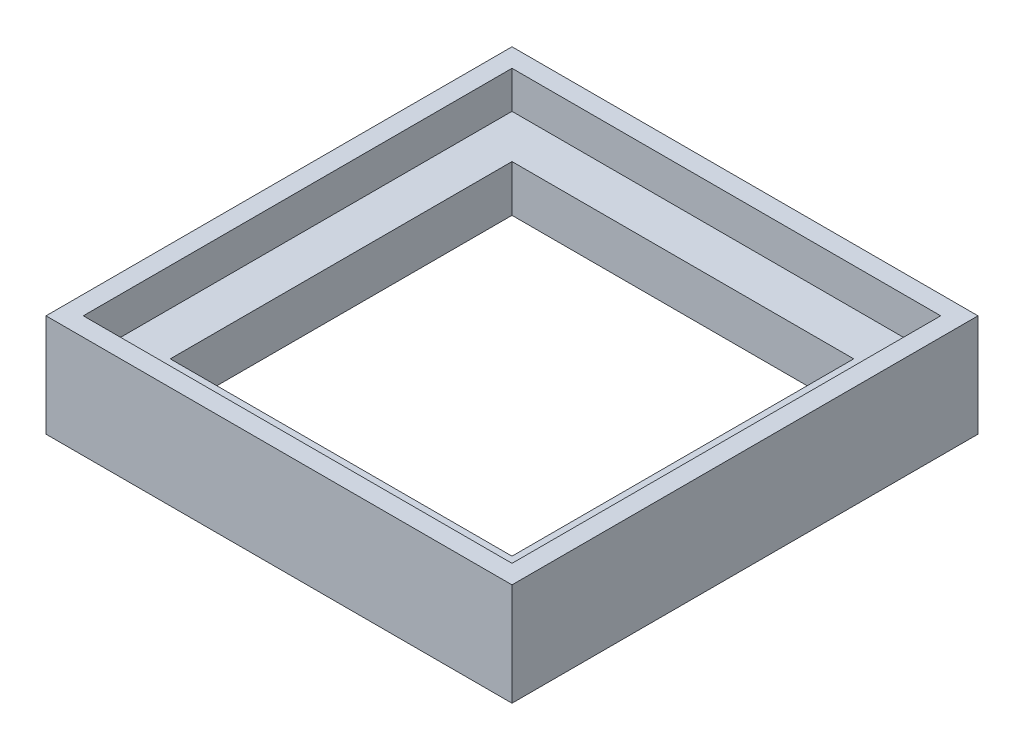
ISO-10303-21;
HEADER;
FILE_DESCRIPTION(('STEP AP214'),'2;1');
FILE_NAME('part.step','',(''),(''),'','','');
FILE_SCHEMA(('AUTOMOTIVE_DESIGN { 1 0 10303 214 1 1 1 1 }'));
ENDSEC;
DATA;
#1=APPLICATION_CONTEXT('core data for automotive mechanical design processes');
#2=APPLICATION_PROTOCOL_DEFINITION('international standard','automotive_design',2000,#1);
#3=PRODUCT_CONTEXT('',#1,'mechanical');
#4=PRODUCT('Part','Part','',(#3));
#5=PRODUCT_RELATED_PRODUCT_CATEGORY('part','',(#4));
#6=PRODUCT_DEFINITION_FORMATION('','',#4);
#7=PRODUCT_DEFINITION_CONTEXT('part definition',#1,'design');
#8=PRODUCT_DEFINITION('design','',#6,#7);
#9=PRODUCT_DEFINITION_SHAPE('','',#8);
#10=(LENGTH_UNIT() NAMED_UNIT(*) SI_UNIT(.MILLI.,.METRE.));
#11=(NAMED_UNIT(*) PLANE_ANGLE_UNIT() SI_UNIT($,.RADIAN.));
#12=(NAMED_UNIT(*) SI_UNIT($,.STERADIAN.) SOLID_ANGLE_UNIT());
#13=UNCERTAINTY_MEASURE_WITH_UNIT(LENGTH_MEASURE(1.E-05),#10,'distance_accuracy_value','');
#14=(GEOMETRIC_REPRESENTATION_CONTEXT(3) GLOBAL_UNCERTAINTY_ASSIGNED_CONTEXT((#13)) GLOBAL_UNIT_ASSIGNED_CONTEXT((#10,
#11,#12)) REPRESENTATION_CONTEXT('',''));
#15=CARTESIAN_POINT('',(0.,0.,0.));
#16=DIRECTION('',(0.,0.,1.));
#17=DIRECTION('',(1.,0.,0.));
#18=AXIS2_PLACEMENT_3D('',#15,#16,#17);
#19=CARTESIAN_POINT('',(0.,21.,0.));
#20=DIRECTION('',(0.,-1.,0.));
#21=DIRECTION('',(0.,0.,-1.));
#22=AXIS2_PLACEMENT_3D('',#19,#20,#21);
#23=PLANE('',#22);
#24=DIRECTION('',(0.,0.,-1.));
#25=VECTOR('',#24,1.);
#26=CARTESIAN_POINT('',(69.,21.,69.));
#27=LINE('',#26,#25);
#28=CARTESIAN_POINT('',(69.,21.,69.));
#29=VERTEX_POINT('',#28);
#30=CARTESIAN_POINT('',(69.,21.,-69.));
#31=VERTEX_POINT('',#30);
#32=EDGE_CURVE('E232',#29,#31,#27,.T.);
#33=ORIENTED_EDGE('',*,*,#32,.T.);
#34=DIRECTION('',(-1.,0.,0.));
#35=VECTOR('',#34,1.);
#36=CARTESIAN_POINT('',(-69.,21.,-69.));
#37=LINE('',#36,#35);
#38=CARTESIAN_POINT('',(-69.,21.,-69.));
#39=VERTEX_POINT('',#38);
#40=EDGE_CURVE('E236',#31,#39,#37,.T.);
#41=ORIENTED_EDGE('',*,*,#40,.T.);
#42=DIRECTION('',(0.,0.,1.));
#43=VECTOR('',#42,1.);
#44=CARTESIAN_POINT('',(-69.,21.,69.));
#45=LINE('',#44,#43);
#46=CARTESIAN_POINT('',(-69.,21.,69.));
#47=VERTEX_POINT('',#46);
#48=EDGE_CURVE('E241',#39,#47,#45,.T.);
#49=ORIENTED_EDGE('',*,*,#48,.T.);
#50=DIRECTION('',(1.,0.,0.));
#51=VECTOR('',#50,1.);
#52=CARTESIAN_POINT('',(-69.,21.,69.));
#53=LINE('',#52,#51);
#54=EDGE_CURVE('E245',#47,#29,#53,.T.);
#55=ORIENTED_EDGE('',*,*,#54,.T.);
#56=EDGE_LOOP('',(#33,#41,#49,#55));
#57=FACE_BOUND('',#56,.T.);
#58=DIRECTION('',(0.,0.,-1.));
#59=VECTOR('',#58,1.);
#60=CARTESIAN_POINT('',(55.,21.,55.));
#61=LINE('',#60,#59);
#62=CARTESIAN_POINT('',(55.,21.,55.));
#63=VERTEX_POINT('',#62);
#64=CARTESIAN_POINT('',(55.,21.,-55.));
#65=VERTEX_POINT('',#64);
#66=EDGE_CURVE('E164',#63,#65,#61,.T.);
#67=ORIENTED_EDGE('',*,*,#66,.F.);
#68=DIRECTION('',(1.,0.,0.));
#69=VECTOR('',#68,1.);
#70=CARTESIAN_POINT('',(-55.,21.,55.));
#71=LINE('',#70,#69);
#72=CARTESIAN_POINT('',(-55.,21.,55.));
#73=VERTEX_POINT('',#72);
#74=EDGE_CURVE('E161',#73,#63,#71,.T.);
#75=ORIENTED_EDGE('',*,*,#74,.F.);
#76=DIRECTION('',(0.,0.,1.));
#77=VECTOR('',#76,1.);
#78=CARTESIAN_POINT('',(-55.,21.,55.));
#79=LINE('',#78,#77);
#80=CARTESIAN_POINT('',(-55.,21.,-55.));
#81=VERTEX_POINT('',#80);
#82=EDGE_CURVE('E55',#81,#73,#79,.T.);
#83=ORIENTED_EDGE('',*,*,#82,.F.);
#84=DIRECTION('',(-1.,0.,0.));
#85=VECTOR('',#84,1.);
#86=CARTESIAN_POINT('',(-55.,21.,-55.));
#87=LINE('',#86,#85);
#88=EDGE_CURVE('E156',#65,#81,#87,.T.);
#89=ORIENTED_EDGE('',*,*,#88,.F.);
#90=EDGE_LOOP('',(#67,#75,#83,#89));
#91=FACE_BOUND('',#90,.T.);
#92=ADVANCED_FACE('F39',(#57,#91),#23,.F.);
#93=CARTESIAN_POINT('',(75.,33.,75.));
#94=DIRECTION('',(-1.,0.,0.));
#95=DIRECTION('',(0.,0.,1.));
#96=AXIS2_PLACEMENT_3D('',#93,#94,#95);
#97=PLANE('',#96);
#98=DIRECTION('',(0.,0.,-1.));
#99=VECTOR('',#98,1.);
#100=CARTESIAN_POINT('',(75.,0.,75.));
#101=LINE('',#100,#99);
#102=CARTESIAN_POINT('',(75.,0.,75.));
#103=VERTEX_POINT('',#102);
#104=CARTESIAN_POINT('',(75.,0.,-75.));
#105=VERTEX_POINT('',#104);
#106=EDGE_CURVE('E266',#103,#105,#101,.T.);
#107=ORIENTED_EDGE('',*,*,#106,.T.);
#108=DIRECTION('',(0.,-1.,0.));
#109=VECTOR('',#108,1.);
#110=CARTESIAN_POINT('',(75.,33.,-75.));
#111=LINE('',#110,#109);
#112=CARTESIAN_POINT('',(75.,33.,-75.));
#113=VERTEX_POINT('',#112);
#114=EDGE_CURVE('E313',#113,#105,#111,.T.);
#115=ORIENTED_EDGE('',*,*,#114,.F.);
#116=DIRECTION('',(0.,0.,-1.));
#117=VECTOR('',#116,1.);
#118=CARTESIAN_POINT('',(75.,33.,75.));
#119=LINE('',#118,#117);
#120=CARTESIAN_POINT('',(75.,33.,75.));
#121=VERTEX_POINT('',#120);
#122=EDGE_CURVE('E276',#121,#113,#119,.T.);
#123=ORIENTED_EDGE('',*,*,#122,.F.);
#124=DIRECTION('',(0.,-1.,0.));
#125=VECTOR('',#124,1.);
#126=CARTESIAN_POINT('',(75.,33.,75.));
#127=LINE('',#126,#125);
#128=EDGE_CURVE('E290',#121,#103,#127,.T.);
#129=ORIENTED_EDGE('',*,*,#128,.T.);
#130=EDGE_LOOP('',(#107,#115,#123,#129));
#131=FACE_BOUND('',#130,.T.);
#132=ADVANCED_FACE('F41',(#131),#97,.F.);
#133=CARTESIAN_POINT('',(-75.,33.,-75.));
#134=DIRECTION('',(0.,0.,1.));
#135=DIRECTION('',(1.,0.,0.));
#136=AXIS2_PLACEMENT_3D('',#133,#134,#135);
#137=PLANE('',#136);
#138=DIRECTION('',(-1.,0.,0.));
#139=VECTOR('',#138,1.);
#140=CARTESIAN_POINT('',(-75.,0.,-75.));
#141=LINE('',#140,#139);
#142=CARTESIAN_POINT('',(-75.,0.,-75.));
#143=VERTEX_POINT('',#142);
#144=EDGE_CURVE('E294',#105,#143,#141,.T.);
#145=ORIENTED_EDGE('',*,*,#144,.T.);
#146=DIRECTION('',(0.,-1.,0.));
#147=VECTOR('',#146,1.);
#148=CARTESIAN_POINT('',(-75.,33.,-75.));
#149=LINE('',#148,#147);
#150=CARTESIAN_POINT('',(-75.,33.,-75.));
#151=VERTEX_POINT('',#150);
#152=EDGE_CURVE('E309',#151,#143,#149,.T.);
#153=ORIENTED_EDGE('',*,*,#152,.F.);
#154=DIRECTION('',(-1.,0.,0.));
#155=VECTOR('',#154,1.);
#156=CARTESIAN_POINT('',(-75.,33.,-75.));
#157=LINE('',#156,#155);
#158=EDGE_CURVE('E280',#113,#151,#157,.T.);
#159=ORIENTED_EDGE('',*,*,#158,.F.);
#160=ORIENTED_EDGE('',*,*,#114,.T.);
#161=EDGE_LOOP('',(#145,#153,#159,#160));
#162=FACE_BOUND('',#161,.T.);
#163=ADVANCED_FACE('F344',(#162),#137,.F.);
#164=CARTESIAN_POINT('',(-75.,33.,75.));
#165=DIRECTION('',(1.,0.,0.));
#166=DIRECTION('',(0.,0.,-1.));
#167=AXIS2_PLACEMENT_3D('',#164,#165,#166);
#168=PLANE('',#167);
#169=DIRECTION('',(0.,0.,1.));
#170=VECTOR('',#169,1.);
#171=CARTESIAN_POINT('',(-75.,0.,75.));
#172=LINE('',#171,#170);
#173=CARTESIAN_POINT('',(-75.,0.,75.));
#174=VERTEX_POINT('',#173);
#175=EDGE_CURVE('E297',#143,#174,#172,.T.);
#176=ORIENTED_EDGE('',*,*,#175,.T.);
#177=DIRECTION('',(0.,-1.,0.));
#178=VECTOR('',#177,1.);
#179=CARTESIAN_POINT('',(-75.,33.,75.));
#180=LINE('',#179,#178);
#181=CARTESIAN_POINT('',(-75.,33.,75.));
#182=VERTEX_POINT('',#181);
#183=EDGE_CURVE('E305',#182,#174,#180,.T.);
#184=ORIENTED_EDGE('',*,*,#183,.F.);
#185=DIRECTION('',(0.,0.,1.));
#186=VECTOR('',#185,1.);
#187=CARTESIAN_POINT('',(-75.,33.,75.));
#188=LINE('',#187,#186);
#189=EDGE_CURVE('E284',#151,#182,#188,.T.);
#190=ORIENTED_EDGE('',*,*,#189,.F.);
#191=ORIENTED_EDGE('',*,*,#152,.T.);
#192=EDGE_LOOP('',(#176,#184,#190,#191));
#193=FACE_BOUND('',#192,.T.);
#194=ADVANCED_FACE('F377',(#193),#168,.F.);
#195=CARTESIAN_POINT('',(-75.,33.,75.));
#196=DIRECTION('',(0.,0.,-1.));
#197=DIRECTION('',(-1.,0.,0.));
#198=AXIS2_PLACEMENT_3D('',#195,#196,#197);
#199=PLANE('',#198);
#200=DIRECTION('',(1.,0.,0.));
#201=VECTOR('',#200,1.);
#202=CARTESIAN_POINT('',(-75.,0.,75.));
#203=LINE('',#202,#201);
#204=EDGE_CURVE('E281',#174,#103,#203,.T.);
#205=ORIENTED_EDGE('',*,*,#204,.T.);
#206=ORIENTED_EDGE('',*,*,#128,.F.);
#207=DIRECTION('',(1.,0.,0.));
#208=VECTOR('',#207,1.);
#209=CARTESIAN_POINT('',(-75.,33.,75.));
#210=LINE('',#209,#208);
#211=EDGE_CURVE('E287',#182,#121,#210,.T.);
#212=ORIENTED_EDGE('',*,*,#211,.F.);
#213=ORIENTED_EDGE('',*,*,#183,.T.);
#214=EDGE_LOOP('',(#205,#206,#212,#213));
#215=FACE_BOUND('',#214,.T.);
#216=ADVANCED_FACE('F370',(#215),#199,.F.);
#217=CARTESIAN_POINT('',(0.,33.,0.));
#218=DIRECTION('',(0.,-1.,0.));
#219=DIRECTION('',(0.,0.,-1.));
#220=AXIS2_PLACEMENT_3D('',#217,#218,#219);
#221=PLANE('',#220);
#222=DIRECTION('',(-1.,0.,0.));
#223=VECTOR('',#222,1.);
#224=CARTESIAN_POINT('',(-69.,33.,-69.));
#225=LINE('',#224,#223);
#226=CARTESIAN_POINT('',(69.,33.,-69.));
#227=VERTEX_POINT('',#226);
#228=CARTESIAN_POINT('',(-69.,33.,-69.));
#229=VERTEX_POINT('',#228);
#230=EDGE_CURVE('E252',#227,#229,#225,.T.);
#231=ORIENTED_EDGE('',*,*,#230,.F.);
#232=DIRECTION('',(0.,0.,-1.));
#233=VECTOR('',#232,1.);
#234=CARTESIAN_POINT('',(69.,33.,69.));
#235=LINE('',#234,#233);
#236=CARTESIAN_POINT('',(69.,33.,69.));
#237=VERTEX_POINT('',#236);
#238=EDGE_CURVE('E222',#237,#227,#235,.T.);
#239=ORIENTED_EDGE('',*,*,#238,.F.);
#240=DIRECTION('',(1.,0.,0.));
#241=VECTOR('',#240,1.);
#242=CARTESIAN_POINT('',(-69.,33.,69.));
#243=LINE('',#242,#241);
#244=CARTESIAN_POINT('',(-69.,33.,69.));
#245=VERTEX_POINT('',#244);
#246=EDGE_CURVE('E237',#245,#237,#243,.T.);
#247=ORIENTED_EDGE('',*,*,#246,.F.);
#248=DIRECTION('',(0.,0.,1.));
#249=VECTOR('',#248,1.);
#250=CARTESIAN_POINT('',(-69.,33.,69.));
#251=LINE('',#250,#249);
#252=EDGE_CURVE('E256',#229,#245,#251,.T.);
#253=ORIENTED_EDGE('',*,*,#252,.F.);
#254=EDGE_LOOP('',(#231,#239,#247,#253));
#255=FACE_BOUND('',#254,.T.);
#256=ORIENTED_EDGE('',*,*,#122,.T.);
#257=ORIENTED_EDGE('',*,*,#158,.T.);
#258=ORIENTED_EDGE('',*,*,#189,.T.);
#259=ORIENTED_EDGE('',*,*,#211,.T.);
#260=EDGE_LOOP('',(#256,#257,#258,#259));
#261=FACE_BOUND('',#260,.T.);
#262=ADVANCED_FACE('F367',(#255,#261),#221,.F.);
#263=CARTESIAN_POINT('',(0.,0.,0.));
#264=DIRECTION('',(0.,-1.,0.));
#265=DIRECTION('',(0.,0.,-1.));
#266=AXIS2_PLACEMENT_3D('',#263,#264,#265);
#267=PLANE('',#266);
#268=DIRECTION('',(0.,0.,1.));
#269=VECTOR('',#268,1.);
#270=CARTESIAN_POINT('',(65.,0.,-65.));
#271=LINE('',#270,#269);
#272=CARTESIAN_POINT('',(65.,0.,-65.));
#273=VERTEX_POINT('',#272);
#274=CARTESIAN_POINT('',(65.,0.,65.));
#275=VERTEX_POINT('',#274);
#276=EDGE_CURVE('E182',#273,#275,#271,.T.);
#277=ORIENTED_EDGE('',*,*,#276,.F.);
#278=DIRECTION('',(1.,0.,0.));
#279=VECTOR('',#278,1.);
#280=CARTESIAN_POINT('',(-65.,0.,-65.));
#281=LINE('',#280,#279);
#282=CARTESIAN_POINT('',(-65.,0.,-65.));
#283=VERTEX_POINT('',#282);
#284=EDGE_CURVE('E193',#283,#273,#281,.T.);
#285=ORIENTED_EDGE('',*,*,#284,.F.);
#286=DIRECTION('',(0.,0.,-1.));
#287=VECTOR('',#286,1.);
#288=CARTESIAN_POINT('',(-65.,0.,-65.));
#289=LINE('',#288,#287);
#290=CARTESIAN_POINT('',(-65.,0.,65.));
#291=VERTEX_POINT('',#290);
#292=EDGE_CURVE('E212',#291,#283,#289,.T.);
#293=ORIENTED_EDGE('',*,*,#292,.F.);
#294=DIRECTION('',(-1.,0.,0.));
#295=VECTOR('',#294,1.);
#296=CARTESIAN_POINT('',(-65.,0.,65.));
#297=LINE('',#296,#295);
#298=EDGE_CURVE('E208',#275,#291,#297,.T.);
#299=ORIENTED_EDGE('',*,*,#298,.F.);
#300=EDGE_LOOP('',(#277,#285,#293,#299));
#301=FACE_BOUND('',#300,.T.);
#302=ORIENTED_EDGE('',*,*,#106,.F.);
#303=ORIENTED_EDGE('',*,*,#204,.F.);
#304=ORIENTED_EDGE('',*,*,#175,.F.);
#305=ORIENTED_EDGE('',*,*,#144,.F.);
#306=EDGE_LOOP('',(#302,#303,#304,#305));
#307=FACE_BOUND('',#306,.T.);
#308=ADVANCED_FACE('F365',(#301,#307),#267,.T.);
#309=CARTESIAN_POINT('',(69.,21.,69.));
#310=DIRECTION('',(1.,0.,0.));
#311=DIRECTION('',(0.,0.,-1.));
#312=AXIS2_PLACEMENT_3D('',#309,#310,#311);
#313=PLANE('',#312);
#314=ORIENTED_EDGE('',*,*,#238,.T.);
#315=DIRECTION('',(0.,1.,0.));
#316=VECTOR('',#315,1.);
#317=CARTESIAN_POINT('',(69.,21.,-69.));
#318=LINE('',#317,#316);
#319=EDGE_CURVE('E249',#31,#227,#318,.T.);
#320=ORIENTED_EDGE('',*,*,#319,.F.);
#321=ORIENTED_EDGE('',*,*,#32,.F.);
#322=DIRECTION('',(0.,1.,0.));
#323=VECTOR('',#322,1.);
#324=CARTESIAN_POINT('',(69.,21.,69.));
#325=LINE('',#324,#323);
#326=EDGE_CURVE('E263',#29,#237,#325,.T.);
#327=ORIENTED_EDGE('',*,*,#326,.T.);
#328=EDGE_LOOP('',(#314,#320,#321,#327));
#329=FACE_BOUND('',#328,.T.);
#330=ADVANCED_FACE('F354',(#329),#313,.F.);
#331=CARTESIAN_POINT('',(-69.,21.,69.));
#332=DIRECTION('',(0.,0.,1.));
#333=DIRECTION('',(1.,0.,0.));
#334=AXIS2_PLACEMENT_3D('',#331,#332,#333);
#335=PLANE('',#334);
#336=ORIENTED_EDGE('',*,*,#246,.T.);
#337=ORIENTED_EDGE('',*,*,#326,.F.);
#338=ORIENTED_EDGE('',*,*,#54,.F.);
#339=DIRECTION('',(0.,1.,0.));
#340=VECTOR('',#339,1.);
#341=CARTESIAN_POINT('',(-69.,21.,69.));
#342=LINE('',#341,#340);
#343=EDGE_CURVE('E267',#47,#245,#342,.T.);
#344=ORIENTED_EDGE('',*,*,#343,.T.);
#345=EDGE_LOOP('',(#336,#337,#338,#344));
#346=FACE_BOUND('',#345,.T.);
#347=ADVANCED_FACE('F350',(#346),#335,.F.);
#348=CARTESIAN_POINT('',(-69.,21.,69.));
#349=DIRECTION('',(-1.,0.,0.));
#350=DIRECTION('',(0.,0.,1.));
#351=AXIS2_PLACEMENT_3D('',#348,#349,#350);
#352=PLANE('',#351);
#353=ORIENTED_EDGE('',*,*,#252,.T.);
#354=ORIENTED_EDGE('',*,*,#343,.F.);
#355=ORIENTED_EDGE('',*,*,#48,.F.);
#356=DIRECTION('',(0.,1.,0.));
#357=VECTOR('',#356,1.);
#358=CARTESIAN_POINT('',(-69.,21.,-69.));
#359=LINE('',#358,#357);
#360=EDGE_CURVE('E270',#39,#229,#359,.T.);
#361=ORIENTED_EDGE('',*,*,#360,.T.);
#362=EDGE_LOOP('',(#353,#354,#355,#361));
#363=FACE_BOUND('',#362,.T.);
#364=ADVANCED_FACE('F353',(#363),#352,.F.);
#365=CARTESIAN_POINT('',(-69.,21.,-69.));
#366=DIRECTION('',(0.,0.,-1.));
#367=DIRECTION('',(-1.,0.,0.));
#368=AXIS2_PLACEMENT_3D('',#365,#366,#367);
#369=PLANE('',#368);
#370=ORIENTED_EDGE('',*,*,#230,.T.);
#371=ORIENTED_EDGE('',*,*,#360,.F.);
#372=ORIENTED_EDGE('',*,*,#40,.F.);
#373=ORIENTED_EDGE('',*,*,#319,.T.);
#374=EDGE_LOOP('',(#370,#371,#372,#373));
#375=FACE_BOUND('',#374,.T.);
#376=ADVANCED_FACE('F358',(#375),#369,.F.);
#377=CARTESIAN_POINT('',(65.,6.,-65.));
#378=DIRECTION('',(1.,0.,0.));
#379=DIRECTION('',(0.,0.,-1.));
#380=AXIS2_PLACEMENT_3D('',#377,#378,#379);
#381=PLANE('',#380);
#382=ORIENTED_EDGE('',*,*,#276,.T.);
#383=DIRECTION('',(0.,-1.,0.));
#384=VECTOR('',#383,1.);
#385=CARTESIAN_POINT('',(65.,6.,65.));
#386=LINE('',#385,#384);
#387=CARTESIAN_POINT('',(65.,6.,65.));
#388=VERTEX_POINT('',#387);
#389=EDGE_CURVE('E205',#388,#275,#386,.T.);
#390=ORIENTED_EDGE('',*,*,#389,.F.);
#391=DIRECTION('',(0.,0.,1.));
#392=VECTOR('',#391,1.);
#393=CARTESIAN_POINT('',(65.,6.,-65.));
#394=LINE('',#393,#392);
#395=CARTESIAN_POINT('',(65.,6.,-65.));
#396=VERTEX_POINT('',#395);
#397=EDGE_CURVE('E188',#396,#388,#394,.T.);
#398=ORIENTED_EDGE('',*,*,#397,.F.);
#399=DIRECTION('',(0.,-1.,0.));
#400=VECTOR('',#399,1.);
#401=CARTESIAN_POINT('',(65.,6.,-65.));
#402=LINE('',#401,#400);
#403=EDGE_CURVE('E219',#396,#273,#402,.T.);
#404=ORIENTED_EDGE('',*,*,#403,.T.);
#405=EDGE_LOOP('',(#382,#390,#398,#404));
#406=FACE_BOUND('',#405,.T.);
#407=ADVANCED_FACE('F348',(#406),#381,.F.);
#408=CARTESIAN_POINT('',(-65.,6.,-65.));
#409=DIRECTION('',(0.,0.,-1.));
#410=DIRECTION('',(-1.,0.,0.));
#411=AXIS2_PLACEMENT_3D('',#408,#409,#410);
#412=PLANE('',#411);
#413=ORIENTED_EDGE('',*,*,#284,.T.);
#414=ORIENTED_EDGE('',*,*,#403,.F.);
#415=DIRECTION('',(1.,0.,0.));
#416=VECTOR('',#415,1.);
#417=CARTESIAN_POINT('',(-65.,6.,-65.));
#418=LINE('',#417,#416);
#419=CARTESIAN_POINT('',(-65.,6.,-65.));
#420=VERTEX_POINT('',#419);
#421=EDGE_CURVE('E201',#420,#396,#418,.T.);
#422=ORIENTED_EDGE('',*,*,#421,.F.);
#423=DIRECTION('',(0.,-1.,0.));
#424=VECTOR('',#423,1.);
#425=CARTESIAN_POINT('',(-65.,6.,-65.));
#426=LINE('',#425,#424);
#427=EDGE_CURVE('E223',#420,#283,#426,.T.);
#428=ORIENTED_EDGE('',*,*,#427,.T.);
#429=EDGE_LOOP('',(#413,#414,#422,#428));
#430=FACE_BOUND('',#429,.T.);
#431=ADVANCED_FACE('F437',(#430),#412,.F.);
#432=CARTESIAN_POINT('',(-65.,6.,-65.));
#433=DIRECTION('',(-1.,0.,0.));
#434=DIRECTION('',(0.,0.,1.));
#435=AXIS2_PLACEMENT_3D('',#432,#433,#434);
#436=PLANE('',#435);
#437=ORIENTED_EDGE('',*,*,#292,.T.);
#438=ORIENTED_EDGE('',*,*,#427,.F.);
#439=DIRECTION('',(0.,0.,-1.));
#440=VECTOR('',#439,1.);
#441=CARTESIAN_POINT('',(-65.,6.,-65.));
#442=LINE('',#441,#440);
#443=CARTESIAN_POINT('',(-65.,6.,65.));
#444=VERTEX_POINT('',#443);
#445=EDGE_CURVE('E197',#444,#420,#442,.T.);
#446=ORIENTED_EDGE('',*,*,#445,.F.);
#447=DIRECTION('',(0.,-1.,0.));
#448=VECTOR('',#447,1.);
#449=CARTESIAN_POINT('',(-65.,6.,65.));
#450=LINE('',#449,#448);
#451=EDGE_CURVE('E226',#444,#291,#450,.T.);
#452=ORIENTED_EDGE('',*,*,#451,.T.);
#453=EDGE_LOOP('',(#437,#438,#446,#452));
#454=FACE_BOUND('',#453,.T.);
#455=ADVANCED_FACE('F444',(#454),#436,.F.);
#456=CARTESIAN_POINT('',(-65.,6.,65.));
#457=DIRECTION('',(0.,0.,1.));
#458=DIRECTION('',(1.,0.,0.));
#459=AXIS2_PLACEMENT_3D('',#456,#457,#458);
#460=PLANE('',#459);
#461=ORIENTED_EDGE('',*,*,#298,.T.);
#462=ORIENTED_EDGE('',*,*,#451,.F.);
#463=DIRECTION('',(-1.,0.,0.));
#464=VECTOR('',#463,1.);
#465=CARTESIAN_POINT('',(-65.,6.,65.));
#466=LINE('',#465,#464);
#467=EDGE_CURVE('E192',#388,#444,#466,.T.);
#468=ORIENTED_EDGE('',*,*,#467,.F.);
#469=ORIENTED_EDGE('',*,*,#389,.T.);
#470=EDGE_LOOP('',(#461,#462,#468,#469));
#471=FACE_BOUND('',#470,.T.);
#472=ADVANCED_FACE('F452',(#471),#460,.F.);
#473=CARTESIAN_POINT('',(0.,6.,0.));
#474=DIRECTION('',(0.,1.,0.));
#475=DIRECTION('',(0.,0.,1.));
#476=AXIS2_PLACEMENT_3D('',#473,#474,#475);
#477=PLANE('',#476);
#478=DIRECTION('',(1.,0.,0.));
#479=VECTOR('',#478,1.);
#480=CARTESIAN_POINT('',(0.,6.,55.));
#481=LINE('',#480,#479);
#482=CARTESIAN_POINT('',(-55.,6.,55.));
#483=VERTEX_POINT('',#482);
#484=CARTESIAN_POINT('',(55.,6.,55.));
#485=VERTEX_POINT('',#484);
#486=EDGE_CURVE('E48',#483,#485,#481,.T.);
#487=ORIENTED_EDGE('',*,*,#486,.T.);
#488=DIRECTION('',(0.,0.,-1.));
#489=VECTOR('',#488,1.);
#490=CARTESIAN_POINT('',(55.,6.,0.));
#491=LINE('',#490,#489);
#492=CARTESIAN_POINT('',(55.,6.,-55.));
#493=VERTEX_POINT('',#492);
#494=EDGE_CURVE('E11',#485,#493,#491,.T.);
#495=ORIENTED_EDGE('',*,*,#494,.T.);
#496=DIRECTION('',(-1.,0.,0.));
#497=VECTOR('',#496,1.);
#498=CARTESIAN_POINT('',(0.,6.,-55.));
#499=LINE('',#498,#497);
#500=CARTESIAN_POINT('',(-55.,6.,-55.));
#501=VERTEX_POINT('',#500);
#502=EDGE_CURVE('E158',#493,#501,#499,.T.);
#503=ORIENTED_EDGE('',*,*,#502,.T.);
#504=DIRECTION('',(0.,0.,1.));
#505=VECTOR('',#504,1.);
#506=CARTESIAN_POINT('',(-55.,6.,0.));
#507=LINE('',#506,#505);
#508=EDGE_CURVE('E319',#501,#483,#507,.T.);
#509=ORIENTED_EDGE('',*,*,#508,.T.);
#510=EDGE_LOOP('',(#487,#495,#503,#509));
#511=FACE_BOUND('',#510,.T.);
#512=ORIENTED_EDGE('',*,*,#397,.T.);
#513=ORIENTED_EDGE('',*,*,#467,.T.);
#514=ORIENTED_EDGE('',*,*,#445,.T.);
#515=ORIENTED_EDGE('',*,*,#421,.T.);
#516=EDGE_LOOP('',(#512,#513,#514,#515));
#517=FACE_BOUND('',#516,.T.);
#518=ADVANCED_FACE('F325',(#511,#517),#477,.F.);
#519=CARTESIAN_POINT('',(55.,0.,55.));
#520=DIRECTION('',(1.,0.,0.));
#521=DIRECTION('',(0.,0.,-1.));
#522=AXIS2_PLACEMENT_3D('',#519,#520,#521);
#523=PLANE('',#522);
#524=DIRECTION('',(0.,1.,0.));
#525=VECTOR('',#524,1.);
#526=CARTESIAN_POINT('',(55.,0.,55.));
#527=LINE('',#526,#525);
#528=EDGE_CURVE('E167',#485,#63,#527,.T.);
#529=ORIENTED_EDGE('',*,*,#528,.T.);
#530=ORIENTED_EDGE('',*,*,#66,.T.);
#531=DIRECTION('',(0.,1.,0.));
#532=VECTOR('',#531,1.);
#533=CARTESIAN_POINT('',(55.,0.,-55.));
#534=LINE('',#533,#532);
#535=EDGE_CURVE('E152',#493,#65,#534,.T.);
#536=ORIENTED_EDGE('',*,*,#535,.F.);
#537=ORIENTED_EDGE('',*,*,#494,.F.);
#538=EDGE_LOOP('',(#529,#530,#536,#537));
#539=FACE_BOUND('',#538,.T.);
#540=ADVANCED_FACE('F165',(#539),#523,.F.);
#541=CARTESIAN_POINT('',(-55.,0.,55.));
#542=DIRECTION('',(0.,0.,1.));
#543=DIRECTION('',(1.,0.,0.));
#544=AXIS2_PLACEMENT_3D('',#541,#542,#543);
#545=PLANE('',#544);
#546=DIRECTION('',(0.,1.,0.));
#547=VECTOR('',#546,1.);
#548=CARTESIAN_POINT('',(-55.,0.,55.));
#549=LINE('',#548,#547);
#550=EDGE_CURVE('E183',#483,#73,#549,.T.);
#551=ORIENTED_EDGE('',*,*,#550,.T.);
#552=ORIENTED_EDGE('',*,*,#74,.T.);
#553=ORIENTED_EDGE('',*,*,#528,.F.);
#554=ORIENTED_EDGE('',*,*,#486,.F.);
#555=EDGE_LOOP('',(#551,#552,#553,#554));
#556=FACE_BOUND('',#555,.T.);
#557=ADVANCED_FACE('F328',(#556),#545,.F.);
#558=CARTESIAN_POINT('',(-55.,0.,55.));
#559=DIRECTION('',(-1.,0.,0.));
#560=DIRECTION('',(0.,0.,1.));
#561=AXIS2_PLACEMENT_3D('',#558,#559,#560);
#562=PLANE('',#561);
#563=DIRECTION('',(0.,1.,0.));
#564=VECTOR('',#563,1.);
#565=CARTESIAN_POINT('',(-55.,0.,-55.));
#566=LINE('',#565,#564);
#567=EDGE_CURVE('E62',#501,#81,#566,.T.);
#568=ORIENTED_EDGE('',*,*,#567,.T.);
#569=ORIENTED_EDGE('',*,*,#82,.T.);
#570=ORIENTED_EDGE('',*,*,#550,.F.);
#571=ORIENTED_EDGE('',*,*,#508,.F.);
#572=EDGE_LOOP('',(#568,#569,#570,#571));
#573=FACE_BOUND('',#572,.T.);
#574=ADVANCED_FACE('F329',(#573),#562,.F.);
#575=CARTESIAN_POINT('',(-55.,0.,-55.));
#576=DIRECTION('',(0.,0.,-1.));
#577=DIRECTION('',(-1.,0.,0.));
#578=AXIS2_PLACEMENT_3D('',#575,#576,#577);
#579=PLANE('',#578);
#580=ORIENTED_EDGE('',*,*,#535,.T.);
#581=ORIENTED_EDGE('',*,*,#88,.T.);
#582=ORIENTED_EDGE('',*,*,#567,.F.);
#583=ORIENTED_EDGE('',*,*,#502,.F.);
#584=EDGE_LOOP('',(#580,#581,#582,#583));
#585=FACE_BOUND('',#584,.T.);
#586=ADVANCED_FACE('F154',(#585),#579,.F.);
#587=CLOSED_SHELL('',(#92,#132,#163,#194,#216,#262,#308,#330,#347,#364,#376,#407,#431,#455,#472,
#518,#540,#557,#574,#586));
#588=MANIFOLD_SOLID_BREP('B2',#587);
#589=ADVANCED_BREP_SHAPE_REPRESENTATION('',(#18,#588),#14);
#590=SHAPE_DEFINITION_REPRESENTATION(#9,#589);
ENDSEC;
END-ISO-10303-21;
